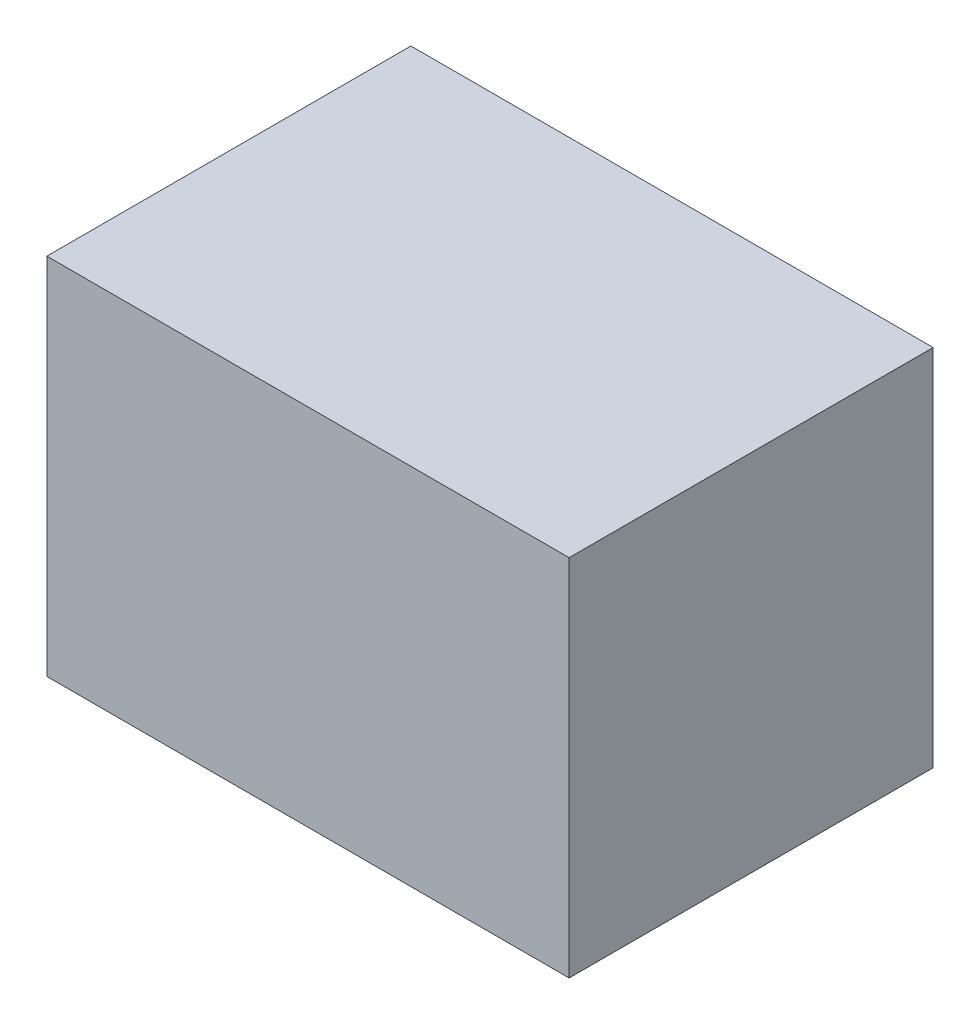
ISO-10303-21;
HEADER;
FILE_DESCRIPTION(('STEP AP214'),'2;1');
FILE_NAME('part.step','',(''),(''),'','','');
FILE_SCHEMA(('AUTOMOTIVE_DESIGN { 1 0 10303 214 1 1 1 1 }'));
ENDSEC;
DATA;
#1=APPLICATION_CONTEXT('core data for automotive mechanical design processes');
#2=APPLICATION_PROTOCOL_DEFINITION('international standard','automotive_design',2000,#1);
#3=PRODUCT_CONTEXT('',#1,'mechanical');
#4=PRODUCT('Part','Part','',(#3));
#5=PRODUCT_RELATED_PRODUCT_CATEGORY('part','',(#4));
#6=PRODUCT_DEFINITION_FORMATION('','',#4);
#7=PRODUCT_DEFINITION_CONTEXT('part definition',#1,'design');
#8=PRODUCT_DEFINITION('design','',#6,#7);
#9=PRODUCT_DEFINITION_SHAPE('','',#8);
#10=(LENGTH_UNIT() NAMED_UNIT(*) SI_UNIT(.MILLI.,.METRE.));
#11=(NAMED_UNIT(*) PLANE_ANGLE_UNIT() SI_UNIT($,.RADIAN.));
#12=(NAMED_UNIT(*) SI_UNIT($,.STERADIAN.) SOLID_ANGLE_UNIT());
#13=UNCERTAINTY_MEASURE_WITH_UNIT(LENGTH_MEASURE(1.E-05),#10,'distance_accuracy_value','');
#14=(GEOMETRIC_REPRESENTATION_CONTEXT(3) GLOBAL_UNCERTAINTY_ASSIGNED_CONTEXT((#13)) GLOBAL_UNIT_ASSIGNED_CONTEXT((#10,
#11,#12)) REPRESENTATION_CONTEXT('',''));
#15=CARTESIAN_POINT('',(0.,0.,0.));
#16=DIRECTION('',(0.,0.,1.));
#17=DIRECTION('',(1.,0.,0.));
#18=AXIS2_PLACEMENT_3D('',#15,#16,#17);
#19=CARTESIAN_POINT('',(-54.9933962264151,-131.373113207547,73.025));
#20=DIRECTION('',(-1.,0.,0.));
#21=DIRECTION('',(0.,0.,1.));
#22=AXIS2_PLACEMENT_3D('',#19,#20,#21);
#23=PLANE('',#22);
#24=DIRECTION('',(0.,1.,0.));
#25=VECTOR('',#24,1.);
#26=CARTESIAN_POINT('',(-54.9933962264151,-131.373113207547,0.));
#27=LINE('',#26,#25);
#28=CARTESIAN_POINT('',(-54.9933962264151,-131.373113207547,0.));
#29=VERTEX_POINT('',#28);
#30=CARTESIAN_POINT('',(-54.9933962264151,-58.3481132075472,0.));
#31=VERTEX_POINT('',#30);
#32=EDGE_CURVE('E96',#29,#31,#27,.T.);
#33=ORIENTED_EDGE('',*,*,#32,.T.);
#34=DIRECTION('',(0.,0.,-1.));
#35=VECTOR('',#34,1.);
#36=CARTESIAN_POINT('',(-54.9933962264151,-58.3481132075472,73.025));
#37=LINE('',#36,#35);
#38=CARTESIAN_POINT('',(-54.9933962264151,-58.3481132075472,73.025));
#39=VERTEX_POINT('',#38);
#40=EDGE_CURVE('E11',#39,#31,#37,.T.);
#41=ORIENTED_EDGE('',*,*,#40,.F.);
#42=DIRECTION('',(0.,1.,0.));
#43=VECTOR('',#42,1.);
#44=CARTESIAN_POINT('',(-54.9933962264151,-131.373113207547,73.025));
#45=LINE('',#44,#43);
#46=CARTESIAN_POINT('',(-54.9933962264151,-131.373113207547,73.025));
#47=VERTEX_POINT('',#46);
#48=EDGE_CURVE('E84',#47,#39,#45,.T.);
#49=ORIENTED_EDGE('',*,*,#48,.F.);
#50=DIRECTION('',(0.,0.,-1.));
#51=VECTOR('',#50,1.);
#52=CARTESIAN_POINT('',(-54.9933962264151,-131.373113207547,73.025));
#53=LINE('',#52,#51);
#54=EDGE_CURVE('E92',#47,#29,#53,.T.);
#55=ORIENTED_EDGE('',*,*,#54,.T.);
#56=EDGE_LOOP('',(#33,#41,#49,#55));
#57=FACE_BOUND('',#56,.T.);
#58=ADVANCED_FACE('F33',(#57),#23,.F.);
#59=CARTESIAN_POINT('',(-159.768396226415,-58.3481132075472,73.025));
#60=DIRECTION('',(0.,-1.,0.));
#61=DIRECTION('',(0.,0.,-1.));
#62=AXIS2_PLACEMENT_3D('',#59,#60,#61);
#63=PLANE('',#62);
#64=DIRECTION('',(-1.,0.,0.));
#65=VECTOR('',#64,1.);
#66=CARTESIAN_POINT('',(-159.768396226415,-58.3481132075472,0.));
#67=LINE('',#66,#65);
#68=CARTESIAN_POINT('',(-159.768396226415,-58.3481132075472,0.));
#69=VERTEX_POINT('',#68);
#70=EDGE_CURVE('E88',#31,#69,#67,.T.);
#71=ORIENTED_EDGE('',*,*,#70,.T.);
#72=DIRECTION('',(0.,0.,-1.));
#73=VECTOR('',#72,1.);
#74=CARTESIAN_POINT('',(-159.768396226415,-58.3481132075472,73.025));
#75=LINE('',#74,#73);
#76=CARTESIAN_POINT('',(-159.768396226415,-58.3481132075472,73.025));
#77=VERTEX_POINT('',#76);
#78=EDGE_CURVE('E41',#77,#69,#75,.T.);
#79=ORIENTED_EDGE('',*,*,#78,.F.);
#80=DIRECTION('',(-1.,0.,0.));
#81=VECTOR('',#80,1.);
#82=CARTESIAN_POINT('',(-159.768396226415,-58.3481132075472,73.025));
#83=LINE('',#82,#81);
#84=EDGE_CURVE('E79',#39,#77,#83,.T.);
#85=ORIENTED_EDGE('',*,*,#84,.F.);
#86=ORIENTED_EDGE('',*,*,#40,.T.);
#87=EDGE_LOOP('',(#71,#79,#85,#86));
#88=FACE_BOUND('',#87,.T.);
#89=ADVANCED_FACE('F87',(#88),#63,.F.);
#90=CARTESIAN_POINT('',(-159.768396226415,-131.373113207547,73.025));
#91=DIRECTION('',(1.,0.,0.));
#92=DIRECTION('',(0.,0.,-1.));
#93=AXIS2_PLACEMENT_3D('',#90,#91,#92);
#94=PLANE('',#93);
#95=DIRECTION('',(0.,-1.,0.));
#96=VECTOR('',#95,1.);
#97=CARTESIAN_POINT('',(-159.768396226415,-131.373113207547,0.));
#98=LINE('',#97,#96);
#99=CARTESIAN_POINT('',(-159.768396226415,-131.373113207547,0.));
#100=VERTEX_POINT('',#99);
#101=EDGE_CURVE('E66',#69,#100,#98,.T.);
#102=ORIENTED_EDGE('',*,*,#101,.T.);
#103=DIRECTION('',(0.,0.,-1.));
#104=VECTOR('',#103,1.);
#105=CARTESIAN_POINT('',(-159.768396226415,-131.373113207547,73.025));
#106=LINE('',#105,#104);
#107=CARTESIAN_POINT('',(-159.768396226415,-131.373113207547,73.025));
#108=VERTEX_POINT('',#107);
#109=EDGE_CURVE('E89',#108,#100,#106,.T.);
#110=ORIENTED_EDGE('',*,*,#109,.F.);
#111=DIRECTION('',(0.,-1.,0.));
#112=VECTOR('',#111,1.);
#113=CARTESIAN_POINT('',(-159.768396226415,-131.373113207547,73.025));
#114=LINE('',#113,#112);
#115=EDGE_CURVE('E82',#77,#108,#114,.T.);
#116=ORIENTED_EDGE('',*,*,#115,.F.);
#117=ORIENTED_EDGE('',*,*,#78,.T.);
#118=EDGE_LOOP('',(#102,#110,#116,#117));
#119=FACE_BOUND('',#118,.T.);
#120=ADVANCED_FACE('F90',(#119),#94,.F.);
#121=CARTESIAN_POINT('',(-159.768396226415,-131.373113207547,73.025));
#122=DIRECTION('',(0.,1.,0.));
#123=DIRECTION('',(0.,0.,1.));
#124=AXIS2_PLACEMENT_3D('',#121,#122,#123);
#125=PLANE('',#124);
#126=DIRECTION('',(1.,0.,0.));
#127=VECTOR('',#126,1.);
#128=CARTESIAN_POINT('',(-159.768396226415,-131.373113207547,0.));
#129=LINE('',#128,#127);
#130=EDGE_CURVE('E72',#100,#29,#129,.T.);
#131=ORIENTED_EDGE('',*,*,#130,.T.);
#132=ORIENTED_EDGE('',*,*,#54,.F.);
#133=DIRECTION('',(1.,0.,0.));
#134=VECTOR('',#133,1.);
#135=CARTESIAN_POINT('',(-159.768396226415,-131.373113207547,73.025));
#136=LINE('',#135,#134);
#137=EDGE_CURVE('E49',#108,#47,#136,.T.);
#138=ORIENTED_EDGE('',*,*,#137,.F.);
#139=ORIENTED_EDGE('',*,*,#109,.T.);
#140=EDGE_LOOP('',(#131,#132,#138,#139));
#141=FACE_BOUND('',#140,.T.);
#142=ADVANCED_FACE('F103',(#141),#125,.F.);
#143=CARTESIAN_POINT('',(0.,0.,73.025));
#144=DIRECTION('',(0.,0.,-1.));
#145=DIRECTION('',(-1.,0.,0.));
#146=AXIS2_PLACEMENT_3D('',#143,#144,#145);
#147=PLANE('',#146);
#148=ORIENTED_EDGE('',*,*,#48,.T.);
#149=ORIENTED_EDGE('',*,*,#84,.T.);
#150=ORIENTED_EDGE('',*,*,#115,.T.);
#151=ORIENTED_EDGE('',*,*,#137,.T.);
#152=EDGE_LOOP('',(#148,#149,#150,#151));
#153=FACE_BOUND('',#152,.T.);
#154=ADVANCED_FACE('F80',(#153),#147,.F.);
#155=CARTESIAN_POINT('',(0.,0.,0.));
#156=DIRECTION('',(0.,0.,-1.));
#157=DIRECTION('',(-1.,0.,0.));
#158=AXIS2_PLACEMENT_3D('',#155,#156,#157);
#159=PLANE('',#158);
#160=ORIENTED_EDGE('',*,*,#32,.F.);
#161=ORIENTED_EDGE('',*,*,#130,.F.);
#162=ORIENTED_EDGE('',*,*,#101,.F.);
#163=ORIENTED_EDGE('',*,*,#70,.F.);
#164=EDGE_LOOP('',(#160,#161,#162,#163));
#165=FACE_BOUND('',#164,.T.);
#166=ADVANCED_FACE('F106',(#165),#159,.T.);
#167=CLOSED_SHELL('',(#58,#89,#120,#142,#154,#166));
#168=MANIFOLD_SOLID_BREP('B2',#167);
#169=ADVANCED_BREP_SHAPE_REPRESENTATION('',(#18,#168),#14);
#170=SHAPE_DEFINITION_REPRESENTATION(#9,#169);
ENDSEC;
END-ISO-10303-21;
